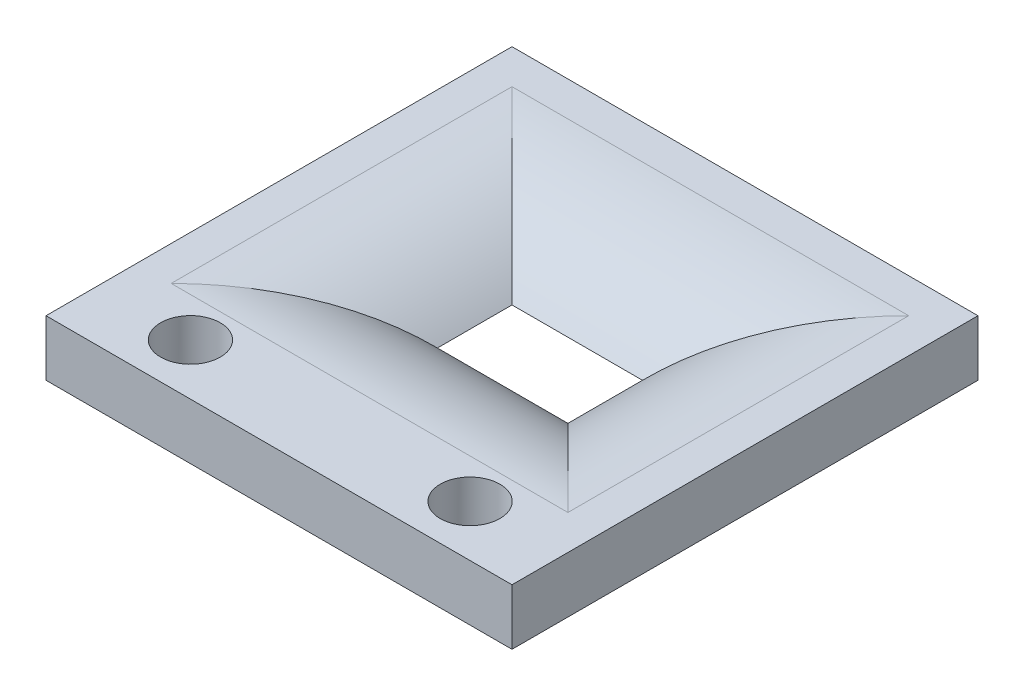
ISO-10303-21;
HEADER;
FILE_DESCRIPTION(('STEP AP214'),'2;1');
FILE_NAME('part.step','',(''),(''),'','','');
FILE_SCHEMA(('AUTOMOTIVE_DESIGN { 1 0 10303 214 1 1 1 1 }'));
ENDSEC;
DATA;
#1=APPLICATION_CONTEXT('core data for automotive mechanical design processes');
#2=APPLICATION_PROTOCOL_DEFINITION('international standard','automotive_design',2000,#1);
#3=PRODUCT_CONTEXT('',#1,'mechanical');
#4=PRODUCT('Part','Part','',(#3));
#5=PRODUCT_RELATED_PRODUCT_CATEGORY('part','',(#4));
#6=PRODUCT_DEFINITION_FORMATION('','',#4);
#7=PRODUCT_DEFINITION_CONTEXT('part definition',#1,'design');
#8=PRODUCT_DEFINITION('design','',#6,#7);
#9=PRODUCT_DEFINITION_SHAPE('','',#8);
#10=(LENGTH_UNIT() NAMED_UNIT(*) SI_UNIT(.MILLI.,.METRE.));
#11=(NAMED_UNIT(*) PLANE_ANGLE_UNIT() SI_UNIT($,.RADIAN.));
#12=(NAMED_UNIT(*) SI_UNIT($,.STERADIAN.) SOLID_ANGLE_UNIT());
#13=UNCERTAINTY_MEASURE_WITH_UNIT(LENGTH_MEASURE(1.E-05),#10,'distance_accuracy_value','');
#14=(GEOMETRIC_REPRESENTATION_CONTEXT(3) GLOBAL_UNCERTAINTY_ASSIGNED_CONTEXT((#13)) GLOBAL_UNIT_ASSIGNED_CONTEXT((#10,
#11,#12)) REPRESENTATION_CONTEXT('',''));
#15=CARTESIAN_POINT('',(0.,0.,0.));
#16=DIRECTION('',(0.,0.,1.));
#17=DIRECTION('',(1.,0.,0.));
#18=AXIS2_PLACEMENT_3D('',#15,#16,#17);
#19=CARTESIAN_POINT('',(12.5,3.,12.5));
#20=DIRECTION('',(-1.,0.,0.));
#21=DIRECTION('',(0.,0.,1.));
#22=AXIS2_PLACEMENT_3D('',#19,#20,#21);
#23=PLANE('',#22);
#24=DIRECTION('',(0.,0.,-1.));
#25=VECTOR('',#24,1.);
#26=CARTESIAN_POINT('',(12.5,0.,12.5));
#27=LINE('',#26,#25);
#28=CARTESIAN_POINT('',(12.5,0.,12.5));
#29=VERTEX_POINT('',#28);
#30=CARTESIAN_POINT('',(12.5,0.,-12.5));
#31=VERTEX_POINT('',#30);
#32=EDGE_CURVE('E164',#29,#31,#27,.T.);
#33=ORIENTED_EDGE('',*,*,#32,.T.);
#34=DIRECTION('',(0.,-1.,0.));
#35=VECTOR('',#34,1.);
#36=CARTESIAN_POINT('',(12.5,3.,-12.5));
#37=LINE('',#36,#35);
#38=CARTESIAN_POINT('',(12.5,3.,-12.5));
#39=VERTEX_POINT('',#38);
#40=EDGE_CURVE('E187',#39,#31,#37,.T.);
#41=ORIENTED_EDGE('',*,*,#40,.F.);
#42=DIRECTION('',(0.,0.,-1.));
#43=VECTOR('',#42,1.);
#44=CARTESIAN_POINT('',(12.5,3.,12.5));
#45=LINE('',#44,#43);
#46=CARTESIAN_POINT('',(12.5,3.,12.5));
#47=VERTEX_POINT('',#46);
#48=EDGE_CURVE('E149',#47,#39,#45,.T.);
#49=ORIENTED_EDGE('',*,*,#48,.F.);
#50=DIRECTION('',(0.,-1.,0.));
#51=VECTOR('',#50,1.);
#52=CARTESIAN_POINT('',(12.5,3.,12.5));
#53=LINE('',#52,#51);
#54=EDGE_CURVE('E163',#47,#29,#53,.T.);
#55=ORIENTED_EDGE('',*,*,#54,.T.);
#56=EDGE_LOOP('',(#33,#41,#49,#55));
#57=FACE_BOUND('',#56,.T.);
#58=ADVANCED_FACE('F38',(#57),#23,.F.);
#59=CARTESIAN_POINT('',(-12.5,3.,-12.5));
#60=DIRECTION('',(0.,0.,1.));
#61=DIRECTION('',(1.,0.,0.));
#62=AXIS2_PLACEMENT_3D('',#59,#60,#61);
#63=PLANE('',#62);
#64=DIRECTION('',(-1.,0.,0.));
#65=VECTOR('',#64,1.);
#66=CARTESIAN_POINT('',(-12.5,0.,-12.5));
#67=LINE('',#66,#65);
#68=CARTESIAN_POINT('',(-12.5,0.,-12.5));
#69=VERTEX_POINT('',#68);
#70=EDGE_CURVE('E168',#31,#69,#67,.T.);
#71=ORIENTED_EDGE('',*,*,#70,.T.);
#72=DIRECTION('',(0.,-1.,0.));
#73=VECTOR('',#72,1.);
#74=CARTESIAN_POINT('',(-12.5,3.,-12.5));
#75=LINE('',#74,#73);
#76=CARTESIAN_POINT('',(-12.5,3.,-12.5));
#77=VERTEX_POINT('',#76);
#78=EDGE_CURVE('E183',#77,#69,#75,.T.);
#79=ORIENTED_EDGE('',*,*,#78,.F.);
#80=DIRECTION('',(-1.,0.,0.));
#81=VECTOR('',#80,1.);
#82=CARTESIAN_POINT('',(-12.5,3.,-12.5));
#83=LINE('',#82,#81);
#84=EDGE_CURVE('E153',#39,#77,#83,.T.);
#85=ORIENTED_EDGE('',*,*,#84,.F.);
#86=ORIENTED_EDGE('',*,*,#40,.T.);
#87=EDGE_LOOP('',(#71,#79,#85,#86));
#88=FACE_BOUND('',#87,.T.);
#89=ADVANCED_FACE('F218',(#88),#63,.F.);
#90=CARTESIAN_POINT('',(-12.5,3.,12.5));
#91=DIRECTION('',(1.,0.,0.));
#92=DIRECTION('',(0.,0.,-1.));
#93=AXIS2_PLACEMENT_3D('',#90,#91,#92);
#94=PLANE('',#93);
#95=DIRECTION('',(0.,0.,1.));
#96=VECTOR('',#95,1.);
#97=CARTESIAN_POINT('',(-12.5,0.,12.5));
#98=LINE('',#97,#96);
#99=CARTESIAN_POINT('',(-12.5,0.,12.5));
#100=VERTEX_POINT('',#99);
#101=EDGE_CURVE('E171',#69,#100,#98,.T.);
#102=ORIENTED_EDGE('',*,*,#101,.T.);
#103=DIRECTION('',(0.,-1.,0.));
#104=VECTOR('',#103,1.);
#105=CARTESIAN_POINT('',(-12.5,3.,12.5));
#106=LINE('',#105,#104);
#107=CARTESIAN_POINT('',(-12.5,3.,12.5));
#108=VERTEX_POINT('',#107);
#109=EDGE_CURVE('E179',#108,#100,#106,.T.);
#110=ORIENTED_EDGE('',*,*,#109,.F.);
#111=DIRECTION('',(0.,0.,1.));
#112=VECTOR('',#111,1.);
#113=CARTESIAN_POINT('',(-12.5,3.,12.5));
#114=LINE('',#113,#112);
#115=EDGE_CURVE('E157',#77,#108,#114,.T.);
#116=ORIENTED_EDGE('',*,*,#115,.F.);
#117=ORIENTED_EDGE('',*,*,#78,.T.);
#118=EDGE_LOOP('',(#102,#110,#116,#117));
#119=FACE_BOUND('',#118,.T.);
#120=ADVANCED_FACE('F224',(#119),#94,.F.);
#121=CARTESIAN_POINT('',(-12.5,3.,12.5));
#122=DIRECTION('',(0.,0.,-1.));
#123=DIRECTION('',(-1.,0.,0.));
#124=AXIS2_PLACEMENT_3D('',#121,#122,#123);
#125=PLANE('',#124);
#126=DIRECTION('',(1.,0.,0.));
#127=VECTOR('',#126,1.);
#128=CARTESIAN_POINT('',(-12.5,0.,12.5));
#129=LINE('',#128,#127);
#130=EDGE_CURVE('E154',#100,#29,#129,.T.);
#131=ORIENTED_EDGE('',*,*,#130,.T.);
#132=ORIENTED_EDGE('',*,*,#54,.F.);
#133=DIRECTION('',(1.,0.,0.));
#134=VECTOR('',#133,1.);
#135=CARTESIAN_POINT('',(-12.5,3.,12.5));
#136=LINE('',#135,#134);
#137=EDGE_CURVE('E160',#108,#47,#136,.T.);
#138=ORIENTED_EDGE('',*,*,#137,.F.);
#139=ORIENTED_EDGE('',*,*,#109,.T.);
#140=EDGE_LOOP('',(#131,#132,#138,#139));
#141=FACE_BOUND('',#140,.T.);
#142=ADVANCED_FACE('F264',(#141),#125,.F.);
#143=CARTESIAN_POINT('',(0.,3.,0.));
#144=DIRECTION('',(0.,-1.,0.));
#145=DIRECTION('',(0.,0.,-1.));
#146=AXIS2_PLACEMENT_3D('',#143,#144,#145);
#147=PLANE('',#146);
#148=DIRECTION('',(-1.,0.,0.));
#149=VECTOR('',#148,1.);
#150=CARTESIAN_POINT('',(0.,3.,-10.6414284285429));
#151=LINE('',#150,#149);
#152=CARTESIAN_POINT('',(-10.6414284285428,3.,-10.6414284285429));
#153=VERTEX_POINT('',#152);
#154=CARTESIAN_POINT('',(10.6414284285429,3.,-10.6414284285429));
#155=VERTEX_POINT('',#154);
#156=EDGE_CURVE('E48',#153,#155,#151,.F.);
#157=ORIENTED_EDGE('',*,*,#156,.T.);
#158=DIRECTION('',(0.,0.,-1.));
#159=VECTOR('',#158,1.);
#160=CARTESIAN_POINT('',(10.6414284285429,3.,0.));
#161=LINE('',#160,#159);
#162=CARTESIAN_POINT('',(10.6414284285429,3.,7.64142842854285));
#163=VERTEX_POINT('',#162);
#164=EDGE_CURVE('E11',#155,#163,#161,.F.);
#165=ORIENTED_EDGE('',*,*,#164,.T.);
#166=DIRECTION('',(1.,0.,0.));
#167=VECTOR('',#166,1.);
#168=CARTESIAN_POINT('',(0.,3.,7.64142842854285));
#169=LINE('',#168,#167);
#170=CARTESIAN_POINT('',(-10.6414284285428,3.,7.64142842854285));
#171=VERTEX_POINT('',#170);
#172=EDGE_CURVE('E197',#163,#171,#169,.F.);
#173=ORIENTED_EDGE('',*,*,#172,.T.);
#174=DIRECTION('',(0.,0.,1.));
#175=VECTOR('',#174,1.);
#176=CARTESIAN_POINT('',(-10.6414284285428,3.,0.));
#177=LINE('',#176,#175);
#178=EDGE_CURVE('E191',#171,#153,#177,.F.);
#179=ORIENTED_EDGE('',*,*,#178,.T.);
#180=EDGE_LOOP('',(#157,#165,#173,#179));
#181=FACE_BOUND('',#180,.T.);
#182=CARTESIAN_POINT('',(-7.49999999999999,3.,9.75));
#183=DIRECTION('',(0.,1.,0.));
#184=DIRECTION('',(0.,0.,1.));
#185=AXIS2_PLACEMENT_3D('',#182,#183,#184);
#186=CIRCLE('',#185,1.6);
#187=CARTESIAN_POINT('',(-7.49999999999999,3.,11.35));
#188=VERTEX_POINT('',#187);
#189=EDGE_CURVE('E134',#188,#188,#186,.T.);
#190=ORIENTED_EDGE('',*,*,#189,.F.);
#191=EDGE_LOOP('',(#190));
#192=FACE_BOUND('',#191,.T.);
#193=CARTESIAN_POINT('',(7.50000000000001,3.,9.75));
#194=DIRECTION('',(0.,1.,0.));
#195=DIRECTION('',(0.,0.,1.));
#196=AXIS2_PLACEMENT_3D('',#193,#194,#195);
#197=CIRCLE('',#196,1.6);
#198=CARTESIAN_POINT('',(7.50000000000001,3.,11.35));
#199=VERTEX_POINT('',#198);
#200=EDGE_CURVE('E144',#199,#199,#197,.T.);
#201=ORIENTED_EDGE('',*,*,#200,.F.);
#202=EDGE_LOOP('',(#201));
#203=FACE_BOUND('',#202,.T.);
#204=ORIENTED_EDGE('',*,*,#48,.T.);
#205=ORIENTED_EDGE('',*,*,#84,.T.);
#206=ORIENTED_EDGE('',*,*,#115,.T.);
#207=ORIENTED_EDGE('',*,*,#137,.T.);
#208=EDGE_LOOP('',(#204,#205,#206,#207));
#209=FACE_BOUND('',#208,.T.);
#210=ADVANCED_FACE('F204',(#181,#192,#203,#209),#147,.F.);
#211=CARTESIAN_POINT('',(0.,0.,0.));
#212=DIRECTION('',(0.,-1.,0.));
#213=DIRECTION('',(0.,0.,-1.));
#214=AXIS2_PLACEMENT_3D('',#211,#212,#213);
#215=PLANE('',#214);
#216=DIRECTION('',(-1.,0.,0.));
#217=VECTOR('',#216,1.);
#218=CARTESIAN_POINT('',(-3.49999999999999,0.,-3.5));
#219=LINE('',#218,#217);
#220=CARTESIAN_POINT('',(3.50000000000001,0.,-3.5));
#221=VERTEX_POINT('',#220);
#222=CARTESIAN_POINT('',(-3.49999999999999,0.,-3.5));
#223=VERTEX_POINT('',#222);
#224=EDGE_CURVE('E108',#221,#223,#219,.T.);
#225=ORIENTED_EDGE('',*,*,#224,.T.);
#226=DIRECTION('',(0.,0.,1.));
#227=VECTOR('',#226,1.);
#228=CARTESIAN_POINT('',(-3.49999999999999,0.,0.499999999999995));
#229=LINE('',#228,#227);
#230=CARTESIAN_POINT('',(-3.49999999999999,0.,0.499999999999995));
#231=VERTEX_POINT('',#230);
#232=EDGE_CURVE('E114',#223,#231,#229,.T.);
#233=ORIENTED_EDGE('',*,*,#232,.T.);
#234=DIRECTION('',(1.,0.,0.));
#235=VECTOR('',#234,1.);
#236=CARTESIAN_POINT('',(-3.49999999999999,0.,0.499999999999995));
#237=LINE('',#236,#235);
#238=CARTESIAN_POINT('',(3.50000000000001,0.,0.499999999999995));
#239=VERTEX_POINT('',#238);
#240=EDGE_CURVE('E121',#231,#239,#237,.T.);
#241=ORIENTED_EDGE('',*,*,#240,.T.);
#242=DIRECTION('',(0.,0.,-1.));
#243=VECTOR('',#242,1.);
#244=CARTESIAN_POINT('',(3.50000000000001,0.,0.499999999999995));
#245=LINE('',#244,#243);
#246=EDGE_CURVE('E126',#239,#221,#245,.T.);
#247=ORIENTED_EDGE('',*,*,#246,.T.);
#248=EDGE_LOOP('',(#225,#233,#241,#247));
#249=FACE_BOUND('',#248,.T.);
#250=CARTESIAN_POINT('',(-7.49999999999999,0.,9.75));
#251=DIRECTION('',(0.,-1.,0.));
#252=DIRECTION('',(0.,0.,-1.));
#253=AXIS2_PLACEMENT_3D('',#250,#251,#252);
#254=CIRCLE('',#253,1.6);
#255=CARTESIAN_POINT('',(-7.49999999999999,0.,8.15));
#256=VERTEX_POINT('',#255);
#257=EDGE_CURVE('E140',#256,#256,#254,.T.);
#258=ORIENTED_EDGE('',*,*,#257,.F.);
#259=EDGE_LOOP('',(#258));
#260=FACE_BOUND('',#259,.T.);
#261=CARTESIAN_POINT('',(7.50000000000001,0.,9.75));
#262=DIRECTION('',(0.,-1.,0.));
#263=DIRECTION('',(0.,0.,-1.));
#264=AXIS2_PLACEMENT_3D('',#261,#262,#263);
#265=CIRCLE('',#264,1.6);
#266=CARTESIAN_POINT('',(7.50000000000001,0.,8.15));
#267=VERTEX_POINT('',#266);
#268=EDGE_CURVE('E148',#267,#267,#265,.T.);
#269=ORIENTED_EDGE('',*,*,#268,.F.);
#270=EDGE_LOOP('',(#269));
#271=FACE_BOUND('',#270,.T.);
#272=ORIENTED_EDGE('',*,*,#32,.F.);
#273=ORIENTED_EDGE('',*,*,#130,.F.);
#274=ORIENTED_EDGE('',*,*,#101,.F.);
#275=ORIENTED_EDGE('',*,*,#70,.F.);
#276=EDGE_LOOP('',(#272,#273,#274,#275));
#277=FACE_BOUND('',#276,.T.);
#278=ADVANCED_FACE('F123',(#249,#260,#271,#277),#215,.T.);
#279=CARTESIAN_POINT('',(7.50000000000001,3.,9.75));
#280=DIRECTION('',(0.,1.,0.));
#281=DIRECTION('',(0.,0.,1.));
#282=AXIS2_PLACEMENT_3D('',#279,#280,#281);
#283=CYLINDRICAL_SURFACE('',#282,1.6);
#284=ORIENTED_EDGE('',*,*,#268,.T.);
#285=EDGE_LOOP('',(#284));
#286=FACE_BOUND('',#285,.T.);
#287=ORIENTED_EDGE('',*,*,#200,.T.);
#288=EDGE_LOOP('',(#287));
#289=FACE_BOUND('',#288,.T.);
#290=ADVANCED_FACE('F256',(#286,#289),#283,.F.);
#291=CARTESIAN_POINT('',(-7.49999999999999,3.,9.75));
#292=DIRECTION('',(0.,1.,0.));
#293=DIRECTION('',(0.,0.,1.));
#294=AXIS2_PLACEMENT_3D('',#291,#292,#293);
#295=CYLINDRICAL_SURFACE('',#294,1.6);
#296=ORIENTED_EDGE('',*,*,#257,.T.);
#297=EDGE_LOOP('',(#296));
#298=FACE_BOUND('',#297,.T.);
#299=ORIENTED_EDGE('',*,*,#189,.T.);
#300=EDGE_LOOP('',(#299));
#301=FACE_BOUND('',#300,.T.);
#302=ADVANCED_FACE('F216',(#298,#301),#295,.F.);
#303=CARTESIAN_POINT('',(-3.49999999999999,-7.,7.64142842854285));
#304=DIRECTION('',(1.,0.,0.));
#305=DIRECTION('',(0.,0.,-1.));
#306=AXIS2_PLACEMENT_3D('',#303,#304,#305);
#307=CYLINDRICAL_SURFACE('',#306,10.);
#308=CARTESIAN_POINT('',(-10.6414284285428,-7.,7.64142842854285));
#309=DIRECTION('',(0.707106781186547,0.,0.707106781186547));
#310=DIRECTION('',(0.707106781186547,0.,-0.707106781186547));
#311=AXIS2_PLACEMENT_3D('',#308,#309,#310);
#312=ELLIPSE('',#311,14.1421356237309,10.);
#313=EDGE_CURVE('E117',#171,#231,#312,.F.);
#314=ORIENTED_EDGE('',*,*,#313,.F.);
#315=ORIENTED_EDGE('',*,*,#172,.F.);
#316=CARTESIAN_POINT('',(10.6414284285429,-7.,7.64142842854285));
#317=DIRECTION('',(0.707106781186547,0.,-0.707106781186547));
#318=DIRECTION('',(0.707106781186547,0.,0.707106781186547));
#319=AXIS2_PLACEMENT_3D('',#316,#317,#318);
#320=ELLIPSE('',#319,14.1421356237309,10.);
#321=EDGE_CURVE('E42',#239,#163,#320,.T.);
#322=ORIENTED_EDGE('',*,*,#321,.F.);
#323=ORIENTED_EDGE('',*,*,#240,.F.);
#324=EDGE_LOOP('',(#314,#315,#322,#323));
#325=FACE_BOUND('',#324,.T.);
#326=ADVANCED_FACE('F40',(#325),#307,.T.);
#327=CARTESIAN_POINT('',(10.6414284285429,-7.,0.499999999999995));
#328=DIRECTION('',(0.,0.,-1.));
#329=DIRECTION('',(-1.,0.,0.));
#330=AXIS2_PLACEMENT_3D('',#327,#328,#329);
#331=CYLINDRICAL_SURFACE('',#330,10.);
#332=ORIENTED_EDGE('',*,*,#321,.T.);
#333=ORIENTED_EDGE('',*,*,#164,.F.);
#334=CARTESIAN_POINT('',(10.6414284285429,-7.,-10.6414284285429));
#335=DIRECTION('',(-0.707106781186547,0.,-0.707106781186547));
#336=DIRECTION('',(-0.707106781186547,0.,0.707106781186547));
#337=AXIS2_PLACEMENT_3D('',#334,#335,#336);
#338=ELLIPSE('',#337,14.1421356237309,10.);
#339=EDGE_CURVE('E56',#221,#155,#338,.T.);
#340=ORIENTED_EDGE('',*,*,#339,.F.);
#341=ORIENTED_EDGE('',*,*,#246,.F.);
#342=EDGE_LOOP('',(#332,#333,#340,#341));
#343=FACE_BOUND('',#342,.T.);
#344=ADVANCED_FACE('F209',(#343),#331,.T.);
#345=CARTESIAN_POINT('',(-10.6414284285428,-7.,0.499999999999995));
#346=DIRECTION('',(0.,0.,1.));
#347=DIRECTION('',(1.,0.,0.));
#348=AXIS2_PLACEMENT_3D('',#345,#346,#347);
#349=CYLINDRICAL_SURFACE('',#348,10.);
#350=ORIENTED_EDGE('',*,*,#313,.T.);
#351=ORIENTED_EDGE('',*,*,#232,.F.);
#352=CARTESIAN_POINT('',(-10.6414284285428,-7.,-10.6414284285429));
#353=DIRECTION('',(-0.707106781186547,0.,0.707106781186547));
#354=DIRECTION('',(-0.707106781186547,0.,-0.707106781186547));
#355=AXIS2_PLACEMENT_3D('',#352,#353,#354);
#356=ELLIPSE('',#355,14.1421356237309,10.);
#357=EDGE_CURVE('E104',#153,#223,#356,.F.);
#358=ORIENTED_EDGE('',*,*,#357,.F.);
#359=ORIENTED_EDGE('',*,*,#178,.F.);
#360=EDGE_LOOP('',(#350,#351,#358,#359));
#361=FACE_BOUND('',#360,.T.);
#362=ADVANCED_FACE('F115',(#361),#349,.T.);
#363=CARTESIAN_POINT('',(-3.49999999999999,-7.,-10.6414284285429));
#364=DIRECTION('',(-1.,0.,0.));
#365=DIRECTION('',(0.,0.,1.));
#366=AXIS2_PLACEMENT_3D('',#363,#364,#365);
#367=CYLINDRICAL_SURFACE('',#366,10.);
#368=ORIENTED_EDGE('',*,*,#339,.T.);
#369=ORIENTED_EDGE('',*,*,#156,.F.);
#370=ORIENTED_EDGE('',*,*,#357,.T.);
#371=ORIENTED_EDGE('',*,*,#224,.F.);
#372=EDGE_LOOP('',(#368,#369,#370,#371));
#373=FACE_BOUND('',#372,.T.);
#374=ADVANCED_FACE('F106',(#373),#367,.T.);
#375=CLOSED_SHELL('',(#58,#89,#120,#142,#210,#278,#290,#302,#326,#344,#362,#374));
#376=MANIFOLD_SOLID_BREP('B2',#375);
#377=ADVANCED_BREP_SHAPE_REPRESENTATION('',(#18,#376),#14);
#378=SHAPE_DEFINITION_REPRESENTATION(#9,#377);
ENDSEC;
END-ISO-10303-21;
